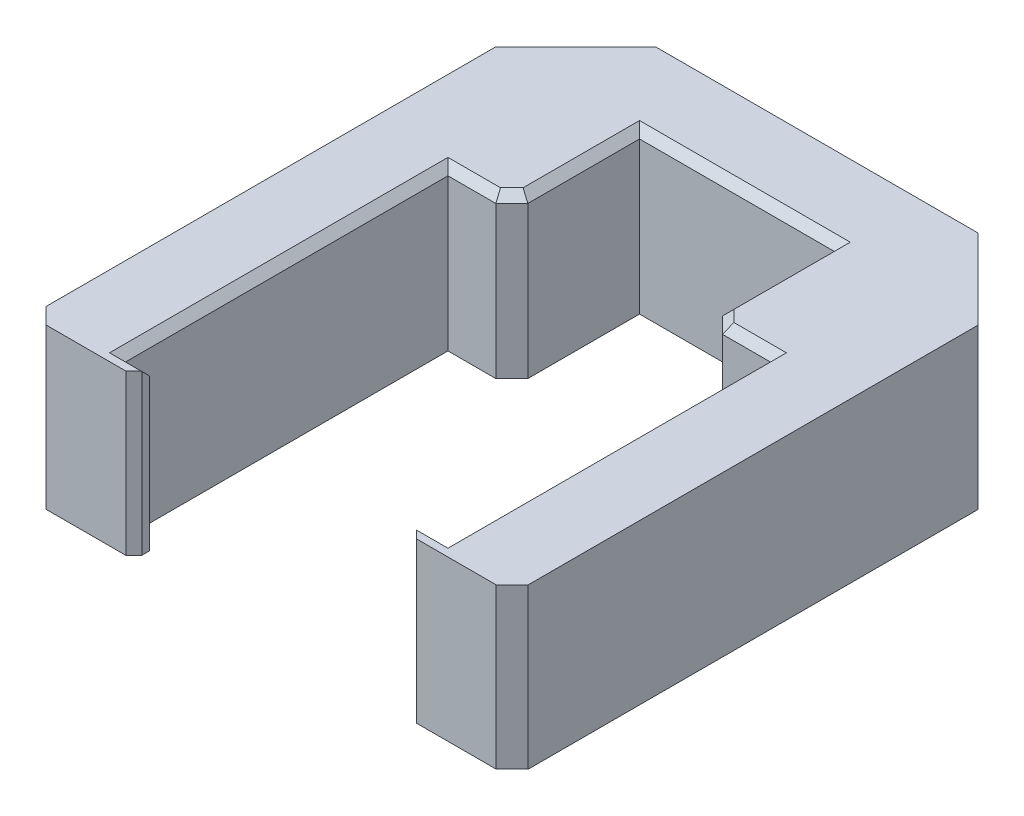
ISO-10303-21;
HEADER;
FILE_DESCRIPTION(('STEP AP214'),'2;1');
FILE_NAME('part.step','',(''),(''),'','','');
FILE_SCHEMA(('AUTOMOTIVE_DESIGN { 1 0 10303 214 1 1 1 1 }'));
ENDSEC;
DATA;
#1=APPLICATION_CONTEXT('core data for automotive mechanical design processes');
#2=APPLICATION_PROTOCOL_DEFINITION('international standard','automotive_design',2000,#1);
#3=PRODUCT_CONTEXT('',#1,'mechanical');
#4=PRODUCT('Part','Part','',(#3));
#5=PRODUCT_RELATED_PRODUCT_CATEGORY('part','',(#4));
#6=PRODUCT_DEFINITION_FORMATION('','',#4);
#7=PRODUCT_DEFINITION_CONTEXT('part definition',#1,'design');
#8=PRODUCT_DEFINITION('design','',#6,#7);
#9=PRODUCT_DEFINITION_SHAPE('','',#8);
#10=(LENGTH_UNIT() NAMED_UNIT(*) SI_UNIT(.MILLI.,.METRE.));
#11=(NAMED_UNIT(*) PLANE_ANGLE_UNIT() SI_UNIT($,.RADIAN.));
#12=(NAMED_UNIT(*) SI_UNIT($,.STERADIAN.) SOLID_ANGLE_UNIT());
#13=UNCERTAINTY_MEASURE_WITH_UNIT(LENGTH_MEASURE(1.E-05),#10,'distance_accuracy_value','');
#14=(GEOMETRIC_REPRESENTATION_CONTEXT(3) GLOBAL_UNCERTAINTY_ASSIGNED_CONTEXT((#13)) GLOBAL_UNIT_ASSIGNED_CONTEXT((#10,
#11,#12)) REPRESENTATION_CONTEXT('',''));
#15=CARTESIAN_POINT('',(0.,0.,0.));
#16=DIRECTION('',(0.,0.,1.));
#17=DIRECTION('',(1.,0.,0.));
#18=AXIS2_PLACEMENT_3D('',#15,#16,#17);
#19=CARTESIAN_POINT('',(18.6,10.,0.));
#20=DIRECTION('',(-1.,0.,0.));
#21=DIRECTION('',(0.,0.,1.));
#22=AXIS2_PLACEMENT_3D('',#19,#20,#21);
#23=PLANE('',#22);
#24=DIRECTION('',(0.,0.,-1.));
#25=VECTOR('',#24,1.);
#26=CARTESIAN_POINT('',(18.6,0.,0.));
#27=LINE('',#26,#25);
#28=CARTESIAN_POINT('',(18.6,0.,0.576654701666499));
#29=VERTEX_POINT('',#28);
#30=CARTESIAN_POINT('',(18.6,0.,0.1));
#31=VERTEX_POINT('',#30);
#32=EDGE_CURVE('E510',#29,#31,#27,.T.);
#33=ORIENTED_EDGE('',*,*,#32,.F.);
#34=DIRECTION('',(0.,1.,0.));
#35=VECTOR('',#34,1.);
#36=CARTESIAN_POINT('',(18.6,10.,0.576654701666499));
#37=LINE('',#36,#35);
#38=CARTESIAN_POINT('',(18.6,9.97665470166651,0.576654701666499));
#39=VERTEX_POINT('',#38);
#40=EDGE_CURVE('E520',#29,#39,#37,.T.);
#41=ORIENTED_EDGE('',*,*,#40,.T.);
#42=DIRECTION('',(0.,0.707106781186552,0.707106781186543));
#43=VECTOR('',#42,1.);
#44=CARTESIAN_POINT('',(18.6,9.7,0.300000000000001));
#45=LINE('',#44,#43);
#46=CARTESIAN_POINT('',(18.6,9.5,0.1));
#47=VERTEX_POINT('',#46);
#48=EDGE_CURVE('E435',#39,#47,#45,.F.);
#49=ORIENTED_EDGE('',*,*,#48,.T.);
#50=DIRECTION('',(0.,-1.,0.));
#51=VECTOR('',#50,1.);
#52=CARTESIAN_POINT('',(18.6,10.,0.1));
#53=LINE('',#52,#51);
#54=EDGE_CURVE('E303',#47,#31,#53,.T.);
#55=ORIENTED_EDGE('',*,*,#54,.T.);
#56=EDGE_LOOP('',(#33,#41,#49,#55));
#57=FACE_BOUND('',#56,.T.);
#58=ADVANCED_FACE('F41',(#57),#23,.T.);
#59=CARTESIAN_POINT('',(0.,10.,1.07665470166651));
#60=DIRECTION('',(0.,0.,1.));
#61=DIRECTION('',(1.,0.,0.));
#62=AXIS2_PLACEMENT_3D('',#59,#60,#61);
#63=PLANE('',#62);
#64=DIRECTION('',(-1.,0.,0.));
#65=VECTOR('',#64,1.);
#66=CARTESIAN_POINT('',(0.,10.,1.07665470166651));
#67=LINE('',#66,#65);
#68=CARTESIAN_POINT('',(24.1000000000001,10.,1.07665470166651));
#69=VERTEX_POINT('',#68);
#70=CARTESIAN_POINT('',(19.1,10.,1.07665470166651));
#71=VERTEX_POINT('',#70);
#72=EDGE_CURVE('E302',#69,#71,#67,.T.);
#73=ORIENTED_EDGE('',*,*,#72,.T.);
#74=DIRECTION('',(0.,-1.,0.));
#75=VECTOR('',#74,1.);
#76=CARTESIAN_POINT('',(19.1,10.,1.07665470166651));
#77=LINE('',#76,#75);
#78=CARTESIAN_POINT('',(19.1,0.,1.07665470166651));
#79=VERTEX_POINT('',#78);
#80=EDGE_CURVE('E470',#71,#79,#77,.T.);
#81=ORIENTED_EDGE('',*,*,#80,.T.);
#82=DIRECTION('',(-1.,0.,0.));
#83=VECTOR('',#82,1.);
#84=CARTESIAN_POINT('',(0.,0.,1.07665470166651));
#85=LINE('',#84,#83);
#86=CARTESIAN_POINT('',(24.1000000000001,0.,1.07665470166651));
#87=VERTEX_POINT('',#86);
#88=EDGE_CURVE('E561',#87,#79,#85,.T.);
#89=ORIENTED_EDGE('',*,*,#88,.F.);
#90=DIRECTION('',(0.,1.,0.));
#91=VECTOR('',#90,1.);
#92=CARTESIAN_POINT('',(24.1000000000001,10.,1.07665470166651));
#93=LINE('',#92,#91);
#94=EDGE_CURVE('E380',#87,#69,#93,.T.);
#95=ORIENTED_EDGE('',*,*,#94,.T.);
#96=EDGE_LOOP('',(#73,#81,#89,#95));
#97=FACE_BOUND('',#96,.T.);
#98=ADVANCED_FACE('F581',(#97),#63,.T.);
#99=CARTESIAN_POINT('',(25.1000000000001,10.,-3.38060018669732E-13));
#100=DIRECTION('',(1.,0.,0.));
#101=DIRECTION('',(0.,0.,-1.));
#102=AXIS2_PLACEMENT_3D('',#99,#100,#101);
#103=PLANE('',#102);
#104=DIRECTION('',(0.,0.,1.));
#105=VECTOR('',#104,1.);
#106=CARTESIAN_POINT('',(25.1000000000001,10.,-3.38060018669732E-13));
#107=LINE('',#106,#105);
#108=CARTESIAN_POINT('',(25.0999999999998,10.,-28.1000000000003));
#109=VERTEX_POINT('',#108);
#110=CARTESIAN_POINT('',(25.1000000000001,10.,0.076654701666525));
#111=VERTEX_POINT('',#110);
#112=EDGE_CURVE('E572',#109,#111,#107,.T.);
#113=ORIENTED_EDGE('',*,*,#112,.T.);
#114=DIRECTION('',(0.,-1.,0.));
#115=VECTOR('',#114,1.);
#116=CARTESIAN_POINT('',(25.1000000000001,10.,0.076654701666525));
#117=LINE('',#116,#115);
#118=CARTESIAN_POINT('',(25.1000000000001,0.,0.076654701666525));
#119=VERTEX_POINT('',#118);
#120=EDGE_CURVE('E376',#111,#119,#117,.T.);
#121=ORIENTED_EDGE('',*,*,#120,.T.);
#122=DIRECTION('',(0.,0.,1.));
#123=VECTOR('',#122,1.);
#124=CARTESIAN_POINT('',(25.1000000000001,0.,-3.38060018669732E-13));
#125=LINE('',#124,#123);
#126=CARTESIAN_POINT('',(25.0999999999998,0.,-28.1000000000003));
#127=VERTEX_POINT('',#126);
#128=EDGE_CURVE('E557',#127,#119,#125,.T.);
#129=ORIENTED_EDGE('',*,*,#128,.F.);
#130=DIRECTION('',(0.,1.,0.));
#131=VECTOR('',#130,1.);
#132=CARTESIAN_POINT('',(25.0999999999998,10.,-28.1000000000003));
#133=LINE('',#132,#131);
#134=EDGE_CURVE('E337',#127,#109,#133,.T.);
#135=ORIENTED_EDGE('',*,*,#134,.T.);
#136=EDGE_LOOP('',(#113,#121,#129,#135));
#137=FACE_BOUND('',#136,.T.);
#138=ADVANCED_FACE('F682',(#137),#103,.T.);
#139=CARTESIAN_POINT('',(0.,10.,-33.1));
#140=DIRECTION('',(0.,0.,-1.));
#141=DIRECTION('',(-1.,0.,0.));
#142=AXIS2_PLACEMENT_3D('',#139,#140,#141);
#143=PLANE('',#142);
#144=DIRECTION('',(1.,0.,0.));
#145=VECTOR('',#144,1.);
#146=CARTESIAN_POINT('',(0.,10.,-33.1));
#147=LINE('',#146,#145);
#148=CARTESIAN_POINT('',(-0.0999999999999896,10.,-33.1));
#149=VERTEX_POINT('',#148);
#150=CARTESIAN_POINT('',(20.0999999999999,10.,-33.1));
#151=VERTEX_POINT('',#150);
#152=EDGE_CURVE('E568',#149,#151,#147,.T.);
#153=ORIENTED_EDGE('',*,*,#152,.T.);
#154=DIRECTION('',(0.,-1.,0.));
#155=VECTOR('',#154,1.);
#156=CARTESIAN_POINT('',(20.0999999999999,10.,-33.1));
#157=LINE('',#156,#155);
#158=CARTESIAN_POINT('',(20.0999999999999,0.,-33.1));
#159=VERTEX_POINT('',#158);
#160=EDGE_CURVE('E327',#151,#159,#157,.T.);
#161=ORIENTED_EDGE('',*,*,#160,.T.);
#162=DIRECTION('',(1.,0.,0.));
#163=VECTOR('',#162,1.);
#164=CARTESIAN_POINT('',(0.,0.,-33.1));
#165=LINE('',#164,#163);
#166=CARTESIAN_POINT('',(-0.0999999999999896,0.,-33.1));
#167=VERTEX_POINT('',#166);
#168=EDGE_CURVE('E551',#167,#159,#165,.T.);
#169=ORIENTED_EDGE('',*,*,#168,.F.);
#170=DIRECTION('',(0.,1.,0.));
#171=VECTOR('',#170,1.);
#172=CARTESIAN_POINT('',(-0.0999999999999896,10.,-33.1));
#173=LINE('',#172,#171);
#174=EDGE_CURVE('E259',#167,#149,#173,.T.);
#175=ORIENTED_EDGE('',*,*,#174,.T.);
#176=EDGE_LOOP('',(#153,#161,#169,#175));
#177=FACE_BOUND('',#176,.T.);
#178=ADVANCED_FACE('F949',(#177),#143,.T.);
#179=CARTESIAN_POINT('',(-5.1,10.,0.));
#180=DIRECTION('',(-1.,0.,0.));
#181=DIRECTION('',(0.,0.,1.));
#182=AXIS2_PLACEMENT_3D('',#179,#180,#181);
#183=PLANE('',#182);
#184=DIRECTION('',(0.,0.,-1.));
#185=VECTOR('',#184,1.);
#186=CARTESIAN_POINT('',(-5.1,0.,0.));
#187=LINE('',#186,#185);
#188=CARTESIAN_POINT('',(-5.1,0.,0.0766547016664981));
#189=VERTEX_POINT('',#188);
#190=CARTESIAN_POINT('',(-5.1,0.,-28.1));
#191=VERTEX_POINT('',#190);
#192=EDGE_CURVE('E549',#189,#191,#187,.T.);
#193=ORIENTED_EDGE('',*,*,#192,.F.);
#194=DIRECTION('',(0.,1.,0.));
#195=VECTOR('',#194,1.);
#196=CARTESIAN_POINT('',(-5.1,10.,0.0766547016664981));
#197=LINE('',#196,#195);
#198=CARTESIAN_POINT('',(-5.1,10.,0.0766547016664981));
#199=VERTEX_POINT('',#198);
#200=EDGE_CURVE('E367',#189,#199,#197,.T.);
#201=ORIENTED_EDGE('',*,*,#200,.T.);
#202=DIRECTION('',(0.,0.,-1.));
#203=VECTOR('',#202,1.);
#204=CARTESIAN_POINT('',(-5.1,10.,0.));
#205=LINE('',#204,#203);
#206=CARTESIAN_POINT('',(-5.1,10.,-28.1));
#207=VERTEX_POINT('',#206);
#208=EDGE_CURVE('E545',#199,#207,#205,.T.);
#209=ORIENTED_EDGE('',*,*,#208,.T.);
#210=DIRECTION('',(0.,-1.,0.));
#211=VECTOR('',#210,1.);
#212=CARTESIAN_POINT('',(-5.1,10.,-28.1));
#213=LINE('',#212,#211);
#214=EDGE_CURVE('E347',#207,#191,#213,.T.);
#215=ORIENTED_EDGE('',*,*,#214,.T.);
#216=EDGE_LOOP('',(#193,#201,#209,#215));
#217=FACE_BOUND('',#216,.T.);
#218=ADVANCED_FACE('F942',(#217),#183,.T.);
#219=CARTESIAN_POINT('',(0.,10.,1.07665470166651));
#220=DIRECTION('',(0.,0.,-1.));
#221=DIRECTION('',(-1.,0.,0.));
#222=AXIS2_PLACEMENT_3D('',#219,#220,#221);
#223=PLANE('',#222);
#224=DIRECTION('',(1.,0.,0.));
#225=VECTOR('',#224,1.);
#226=CARTESIAN_POINT('',(0.,0.,1.07665470166651));
#227=LINE('',#226,#225);
#228=CARTESIAN_POINT('',(-4.09999999999999,0.,1.07665470166651));
#229=VERTEX_POINT('',#228);
#230=CARTESIAN_POINT('',(0.900000000000001,0.,1.07665470166651));
#231=VERTEX_POINT('',#230);
#232=EDGE_CURVE('E250',#229,#231,#227,.T.);
#233=ORIENTED_EDGE('',*,*,#232,.T.);
#234=DIRECTION('',(0.,1.,0.));
#235=VECTOR('',#234,1.);
#236=CARTESIAN_POINT('',(0.900000000000001,10.,1.07665470166651));
#237=LINE('',#236,#235);
#238=CARTESIAN_POINT('',(0.900000000000001,10.,1.07665470166651));
#239=VERTEX_POINT('',#238);
#240=EDGE_CURVE('E50',#231,#239,#237,.T.);
#241=ORIENTED_EDGE('',*,*,#240,.T.);
#242=DIRECTION('',(1.,0.,0.));
#243=VECTOR('',#242,1.);
#244=CARTESIAN_POINT('',(0.,10.,1.07665470166651));
#245=LINE('',#244,#243);
#246=CARTESIAN_POINT('',(-4.09999999999999,10.,1.07665470166651));
#247=VERTEX_POINT('',#246);
#248=EDGE_CURVE('E308',#247,#239,#245,.T.);
#249=ORIENTED_EDGE('',*,*,#248,.F.);
#250=DIRECTION('',(0.,-1.,0.));
#251=VECTOR('',#250,1.);
#252=CARTESIAN_POINT('',(-4.09999999999999,0.,1.07665470166651));
#253=LINE('',#252,#251);
#254=EDGE_CURVE('E351',#247,#229,#253,.T.);
#255=ORIENTED_EDGE('',*,*,#254,.T.);
#256=EDGE_LOOP('',(#233,#241,#249,#255));
#257=FACE_BOUND('',#256,.T.);
#258=ADVANCED_FACE('F537',(#257),#223,.F.);
#259=CARTESIAN_POINT('',(1.4,10.,0.));
#260=DIRECTION('',(-1.,0.,0.));
#261=DIRECTION('',(0.,0.,1.));
#262=AXIS2_PLACEMENT_3D('',#259,#260,#261);
#263=PLANE('',#262);
#264=DIRECTION('',(0.,-0.707106781186552,-0.707106781186543));
#265=VECTOR('',#264,1.);
#266=CARTESIAN_POINT('',(1.4,9.5,0.1));
#267=LINE('',#266,#265);
#268=CARTESIAN_POINT('',(1.4,9.5,0.1));
#269=VERTEX_POINT('',#268);
#270=CARTESIAN_POINT('',(1.4,9.97665470166653,0.576654701666519));
#271=VERTEX_POINT('',#270);
#272=EDGE_CURVE('E461',#269,#271,#267,.F.);
#273=ORIENTED_EDGE('',*,*,#272,.T.);
#274=DIRECTION('',(0.,-1.,0.));
#275=VECTOR('',#274,1.);
#276=CARTESIAN_POINT('',(1.4,10.,0.576654701666519));
#277=LINE('',#276,#275);
#278=CARTESIAN_POINT('',(1.4,0.,0.576654701666519));
#279=VERTEX_POINT('',#278);
#280=EDGE_CURVE('E245',#271,#279,#277,.T.);
#281=ORIENTED_EDGE('',*,*,#280,.T.);
#282=DIRECTION('',(0.,0.,-1.));
#283=VECTOR('',#282,1.);
#284=CARTESIAN_POINT('',(1.4,0.,0.));
#285=LINE('',#284,#283);
#286=CARTESIAN_POINT('',(1.4,0.,0.1));
#287=VERTEX_POINT('',#286);
#288=EDGE_CURVE('E240',#279,#287,#285,.T.);
#289=ORIENTED_EDGE('',*,*,#288,.T.);
#290=DIRECTION('',(0.,-1.,0.));
#291=VECTOR('',#290,1.);
#292=CARTESIAN_POINT('',(1.4,10.,0.1));
#293=LINE('',#292,#291);
#294=EDGE_CURVE('E243',#269,#287,#293,.T.);
#295=ORIENTED_EDGE('',*,*,#294,.F.);
#296=EDGE_LOOP('',(#273,#281,#289,#295));
#297=FACE_BOUND('',#296,.T.);
#298=ADVANCED_FACE('F242',(#297),#263,.F.);
#299=CARTESIAN_POINT('',(0.,10.,0.1));
#300=DIRECTION('',(0.,0.,-1.));
#301=DIRECTION('',(-1.,0.,0.));
#302=AXIS2_PLACEMENT_3D('',#299,#300,#301);
#303=PLANE('',#302);
#304=DIRECTION('',(0.,-1.,0.));
#305=VECTOR('',#304,1.);
#306=CARTESIAN_POINT('',(-0.1,10.,0.1));
#307=LINE('',#306,#305);
#308=CARTESIAN_POINT('',(-0.1,9.5,0.1));
#309=VERTEX_POINT('',#308);
#310=CARTESIAN_POINT('',(-0.1,0.,0.1));
#311=VERTEX_POINT('',#310);
#312=EDGE_CURVE('E260',#309,#311,#307,.T.);
#313=ORIENTED_EDGE('',*,*,#312,.F.);
#314=DIRECTION('',(1.,0.,0.));
#315=VECTOR('',#314,1.);
#316=CARTESIAN_POINT('',(0.,9.5,0.1));
#317=LINE('',#316,#315);
#318=EDGE_CURVE('E257',#309,#269,#317,.T.);
#319=ORIENTED_EDGE('',*,*,#318,.T.);
#320=ORIENTED_EDGE('',*,*,#294,.T.);
#321=DIRECTION('',(1.,0.,0.));
#322=VECTOR('',#321,1.);
#323=CARTESIAN_POINT('',(0.,0.,0.1));
#324=LINE('',#323,#322);
#325=EDGE_CURVE('E249',#311,#287,#324,.T.);
#326=ORIENTED_EDGE('',*,*,#325,.F.);
#327=EDGE_LOOP('',(#313,#319,#320,#326));
#328=FACE_BOUND('',#327,.T.);
#329=ADVANCED_FACE('F255',(#328),#303,.T.);
#330=CARTESIAN_POINT('',(-0.1,10.,0.));
#331=DIRECTION('',(-1.,0.,0.));
#332=DIRECTION('',(0.,0.,1.));
#333=AXIS2_PLACEMENT_3D('',#330,#331,#332);
#334=PLANE('',#333);
#335=DIRECTION('',(0.,-1.,0.));
#336=VECTOR('',#335,1.);
#337=CARTESIAN_POINT('',(-0.1,10.,-20.1));
#338=LINE('',#337,#336);
#339=CARTESIAN_POINT('',(-0.1,9.5,-20.1));
#340=VERTEX_POINT('',#339);
#341=CARTESIAN_POINT('',(-0.1,0.,-20.1));
#342=VERTEX_POINT('',#341);
#343=EDGE_CURVE('E320',#340,#342,#338,.T.);
#344=ORIENTED_EDGE('',*,*,#343,.F.);
#345=DIRECTION('',(0.,0.,1.));
#346=VECTOR('',#345,1.);
#347=CARTESIAN_POINT('',(-0.1,9.5,0.1));
#348=LINE('',#347,#346);
#349=EDGE_CURVE('E467',#340,#309,#348,.T.);
#350=ORIENTED_EDGE('',*,*,#349,.T.);
#351=ORIENTED_EDGE('',*,*,#312,.T.);
#352=DIRECTION('',(0.,0.,-1.));
#353=VECTOR('',#352,1.);
#354=CARTESIAN_POINT('',(-0.1,0.,0.));
#355=LINE('',#354,#353);
#356=EDGE_CURVE('E267',#311,#342,#355,.T.);
#357=ORIENTED_EDGE('',*,*,#356,.T.);
#358=EDGE_LOOP('',(#344,#350,#351,#357));
#359=FACE_BOUND('',#358,.T.);
#360=ADVANCED_FACE('F663',(#359),#334,.F.);
#361=CARTESIAN_POINT('',(0.,10.,-20.1));
#362=DIRECTION('',(0.,0.,-1.));
#363=DIRECTION('',(-1.,0.,0.));
#364=AXIS2_PLACEMENT_3D('',#361,#362,#363);
#365=PLANE('',#364);
#366=DIRECTION('',(0.,1.,0.));
#367=VECTOR('',#366,1.);
#368=CARTESIAN_POINT('',(2.89999999999999,10.,-20.1));
#369=LINE('',#368,#367);
#370=CARTESIAN_POINT('',(2.89999999999999,0.,-20.1));
#371=VERTEX_POINT('',#370);
#372=CARTESIAN_POINT('',(2.89999999999999,9.5,-20.1));
#373=VERTEX_POINT('',#372);
#374=EDGE_CURVE('E393',#371,#373,#369,.T.);
#375=ORIENTED_EDGE('',*,*,#374,.T.);
#376=DIRECTION('',(-1.,0.,0.));
#377=VECTOR('',#376,1.);
#378=CARTESIAN_POINT('',(-0.1,9.5,-20.1));
#379=LINE('',#378,#377);
#380=EDGE_CURVE('E464',#373,#340,#379,.T.);
#381=ORIENTED_EDGE('',*,*,#380,.T.);
#382=ORIENTED_EDGE('',*,*,#343,.T.);
#383=DIRECTION('',(1.,0.,0.));
#384=VECTOR('',#383,1.);
#385=CARTESIAN_POINT('',(0.,0.,-20.1));
#386=LINE('',#385,#384);
#387=EDGE_CURVE('E271',#342,#371,#386,.T.);
#388=ORIENTED_EDGE('',*,*,#387,.T.);
#389=EDGE_LOOP('',(#375,#381,#382,#388));
#390=FACE_BOUND('',#389,.T.);
#391=ADVANCED_FACE('F660',(#390),#365,.F.);
#392=CARTESIAN_POINT('',(3.9,10.,0.));
#393=DIRECTION('',(-1.,0.,0.));
#394=DIRECTION('',(0.,0.,1.));
#395=AXIS2_PLACEMENT_3D('',#392,#393,#394);
#396=PLANE('',#395);
#397=DIRECTION('',(0.,-1.,0.));
#398=VECTOR('',#397,1.);
#399=CARTESIAN_POINT('',(3.9,10.,-28.1));
#400=LINE('',#399,#398);
#401=CARTESIAN_POINT('',(3.9,9.5,-28.1));
#402=VERTEX_POINT('',#401);
#403=CARTESIAN_POINT('',(3.9,0.,-28.1));
#404=VERTEX_POINT('',#403);
#405=EDGE_CURVE('E317',#402,#404,#400,.T.);
#406=ORIENTED_EDGE('',*,*,#405,.F.);
#407=DIRECTION('',(0.,0.,1.));
#408=VECTOR('',#407,1.);
#409=CARTESIAN_POINT('',(3.9,9.5,-21.1));
#410=LINE('',#409,#408);
#411=CARTESIAN_POINT('',(3.9,9.5,-21.1));
#412=VERTEX_POINT('',#411);
#413=EDGE_CURVE('E453',#402,#412,#410,.T.);
#414=ORIENTED_EDGE('',*,*,#413,.T.);
#415=DIRECTION('',(0.,-1.,0.));
#416=VECTOR('',#415,1.);
#417=CARTESIAN_POINT('',(3.9,10.,-21.1));
#418=LINE('',#417,#416);
#419=CARTESIAN_POINT('',(3.9,0.,-21.1));
#420=VERTEX_POINT('',#419);
#421=EDGE_CURVE('E390',#412,#420,#418,.T.);
#422=ORIENTED_EDGE('',*,*,#421,.T.);
#423=DIRECTION('',(0.,0.,-1.));
#424=VECTOR('',#423,1.);
#425=CARTESIAN_POINT('',(3.9,0.,0.));
#426=LINE('',#425,#424);
#427=EDGE_CURVE('E278',#420,#404,#426,.T.);
#428=ORIENTED_EDGE('',*,*,#427,.T.);
#429=EDGE_LOOP('',(#406,#414,#422,#428));
#430=FACE_BOUND('',#429,.T.);
#431=ADVANCED_FACE('F643',(#430),#396,.F.);
#432=CARTESIAN_POINT('',(0.,10.,-28.1));
#433=DIRECTION('',(0.,0.,-1.));
#434=DIRECTION('',(-1.,0.,0.));
#435=AXIS2_PLACEMENT_3D('',#432,#433,#434);
#436=PLANE('',#435);
#437=DIRECTION('',(0.,-1.,0.));
#438=VECTOR('',#437,1.);
#439=CARTESIAN_POINT('',(16.1,10.,-28.1));
#440=LINE('',#439,#438);
#441=CARTESIAN_POINT('',(16.1,9.5,-28.1));
#442=VERTEX_POINT('',#441);
#443=CARTESIAN_POINT('',(16.1,0.,-28.1));
#444=VERTEX_POINT('',#443);
#445=EDGE_CURVE('E314',#442,#444,#440,.T.);
#446=ORIENTED_EDGE('',*,*,#445,.F.);
#447=DIRECTION('',(-1.,0.,0.));
#448=VECTOR('',#447,1.);
#449=CARTESIAN_POINT('',(3.9,9.5,-28.1));
#450=LINE('',#449,#448);
#451=EDGE_CURVE('E450',#442,#402,#450,.T.);
#452=ORIENTED_EDGE('',*,*,#451,.T.);
#453=ORIENTED_EDGE('',*,*,#405,.T.);
#454=DIRECTION('',(1.,0.,0.));
#455=VECTOR('',#454,1.);
#456=CARTESIAN_POINT('',(0.,0.,-28.1));
#457=LINE('',#456,#455);
#458=EDGE_CURVE('E282',#404,#444,#457,.T.);
#459=ORIENTED_EDGE('',*,*,#458,.T.);
#460=EDGE_LOOP('',(#446,#452,#453,#459));
#461=FACE_BOUND('',#460,.T.);
#462=ADVANCED_FACE('F622',(#461),#436,.F.);
#463=CARTESIAN_POINT('',(16.1,10.,0.));
#464=DIRECTION('',(-1.,0.,0.));
#465=DIRECTION('',(0.,0.,1.));
#466=AXIS2_PLACEMENT_3D('',#463,#464,#465);
#467=PLANE('',#466);
#468=DIRECTION('',(0.,1.,0.));
#469=VECTOR('',#468,1.);
#470=CARTESIAN_POINT('',(16.1,10.,-21.1));
#471=LINE('',#470,#469);
#472=CARTESIAN_POINT('',(16.1,0.,-21.1));
#473=VERTEX_POINT('',#472);
#474=CARTESIAN_POINT('',(16.1,9.5,-21.1));
#475=VERTEX_POINT('',#474);
#476=EDGE_CURVE('E386',#473,#475,#471,.T.);
#477=ORIENTED_EDGE('',*,*,#476,.T.);
#478=DIRECTION('',(0.,0.,-1.));
#479=VECTOR('',#478,1.);
#480=CARTESIAN_POINT('',(16.1,9.5,0.));
#481=LINE('',#480,#479);
#482=EDGE_CURVE('E447',#475,#442,#481,.T.);
#483=ORIENTED_EDGE('',*,*,#482,.T.);
#484=ORIENTED_EDGE('',*,*,#445,.T.);
#485=DIRECTION('',(0.,0.,-1.));
#486=VECTOR('',#485,1.);
#487=CARTESIAN_POINT('',(16.1,0.,0.));
#488=LINE('',#487,#486);
#489=EDGE_CURVE('E286',#473,#444,#488,.T.);
#490=ORIENTED_EDGE('',*,*,#489,.F.);
#491=EDGE_LOOP('',(#477,#483,#484,#490));
#492=FACE_BOUND('',#491,.T.);
#493=ADVANCED_FACE('F617',(#492),#467,.T.);
#494=CARTESIAN_POINT('',(0.,10.,-20.1));
#495=DIRECTION('',(0.,0.,-1.));
#496=DIRECTION('',(-1.,0.,0.));
#497=AXIS2_PLACEMENT_3D('',#494,#495,#496);
#498=PLANE('',#497);
#499=DIRECTION('',(0.,-1.,0.));
#500=VECTOR('',#499,1.);
#501=CARTESIAN_POINT('',(20.1,10.,-20.1));
#502=LINE('',#501,#500);
#503=CARTESIAN_POINT('',(20.1,9.5,-20.1));
#504=VERTEX_POINT('',#503);
#505=CARTESIAN_POINT('',(20.1,0.,-20.1));
#506=VERTEX_POINT('',#505);
#507=EDGE_CURVE('E311',#504,#506,#502,.T.);
#508=ORIENTED_EDGE('',*,*,#507,.F.);
#509=DIRECTION('',(-1.,0.,0.));
#510=VECTOR('',#509,1.);
#511=CARTESIAN_POINT('',(17.1,9.5,-20.1));
#512=LINE('',#511,#510);
#513=CARTESIAN_POINT('',(17.1,9.5,-20.1));
#514=VERTEX_POINT('',#513);
#515=EDGE_CURVE('E441',#504,#514,#512,.T.);
#516=ORIENTED_EDGE('',*,*,#515,.T.);
#517=DIRECTION('',(0.,-1.,0.));
#518=VECTOR('',#517,1.);
#519=CARTESIAN_POINT('',(17.1,0.,-20.1));
#520=LINE('',#519,#518);
#521=CARTESIAN_POINT('',(17.1,0.,-20.1));
#522=VERTEX_POINT('',#521);
#523=EDGE_CURVE('E383',#514,#522,#520,.T.);
#524=ORIENTED_EDGE('',*,*,#523,.T.);
#525=DIRECTION('',(1.,0.,0.));
#526=VECTOR('',#525,1.);
#527=CARTESIAN_POINT('',(0.,0.,-20.1));
#528=LINE('',#527,#526);
#529=EDGE_CURVE('E290',#522,#506,#528,.T.);
#530=ORIENTED_EDGE('',*,*,#529,.T.);
#531=EDGE_LOOP('',(#508,#516,#524,#530));
#532=FACE_BOUND('',#531,.T.);
#533=ADVANCED_FACE('F607',(#532),#498,.F.);
#534=CARTESIAN_POINT('',(20.1,10.,0.));
#535=DIRECTION('',(-1.,0.,0.));
#536=DIRECTION('',(0.,0.,1.));
#537=AXIS2_PLACEMENT_3D('',#534,#535,#536);
#538=PLANE('',#537);
#539=DIRECTION('',(0.,-1.,0.));
#540=VECTOR('',#539,1.);
#541=CARTESIAN_POINT('',(20.1000000000001,10.,0.1));
#542=LINE('',#541,#540);
#543=CARTESIAN_POINT('',(20.1000000000001,9.5,0.1));
#544=VERTEX_POINT('',#543);
#545=CARTESIAN_POINT('',(20.1000000000001,0.,0.1));
#546=VERTEX_POINT('',#545);
#547=EDGE_CURVE('E307',#544,#546,#542,.T.);
#548=ORIENTED_EDGE('',*,*,#547,.F.);
#549=DIRECTION('',(0.,0.,-1.));
#550=VECTOR('',#549,1.);
#551=CARTESIAN_POINT('',(20.1,9.5,0.));
#552=LINE('',#551,#550);
#553=EDGE_CURVE('E438',#544,#504,#552,.T.);
#554=ORIENTED_EDGE('',*,*,#553,.T.);
#555=ORIENTED_EDGE('',*,*,#507,.T.);
#556=DIRECTION('',(0.,0.,-1.));
#557=VECTOR('',#556,1.);
#558=CARTESIAN_POINT('',(20.1,0.,0.));
#559=LINE('',#558,#557);
#560=EDGE_CURVE('E294',#546,#506,#559,.T.);
#561=ORIENTED_EDGE('',*,*,#560,.F.);
#562=EDGE_LOOP('',(#548,#554,#555,#561));
#563=FACE_BOUND('',#562,.T.);
#564=ADVANCED_FACE('F602',(#563),#538,.T.);
#565=CARTESIAN_POINT('',(0.,10.,0.100000000000001));
#566=DIRECTION('',(0.,0.,-1.));
#567=DIRECTION('',(-1.,0.,0.));
#568=AXIS2_PLACEMENT_3D('',#565,#566,#567);
#569=PLANE('',#568);
#570=ORIENTED_EDGE('',*,*,#54,.F.);
#571=DIRECTION('',(1.,0.,0.));
#572=VECTOR('',#571,1.);
#573=CARTESIAN_POINT('',(0.,9.5,0.100000000000001));
#574=LINE('',#573,#572);
#575=EDGE_CURVE('E397',#47,#544,#574,.T.);
#576=ORIENTED_EDGE('',*,*,#575,.T.);
#577=ORIENTED_EDGE('',*,*,#547,.T.);
#578=DIRECTION('',(1.,0.,0.));
#579=VECTOR('',#578,1.);
#580=CARTESIAN_POINT('',(0.,0.,0.100000000000001));
#581=LINE('',#580,#579);
#582=EDGE_CURVE('E298',#31,#546,#581,.T.);
#583=ORIENTED_EDGE('',*,*,#582,.F.);
#584=EDGE_LOOP('',(#570,#576,#577,#583));
#585=FACE_BOUND('',#584,.T.);
#586=ADVANCED_FACE('F597',(#585),#569,.T.);
#587=CARTESIAN_POINT('',(0.,10.,0.));
#588=DIRECTION('',(0.,1.,0.));
#589=DIRECTION('',(0.,0.,1.));
#590=AXIS2_PLACEMENT_3D('',#587,#588,#589);
#591=PLANE('',#590);
#592=DIRECTION('',(-1.,0.,0.));
#593=VECTOR('',#592,1.);
#594=CARTESIAN_POINT('',(0.,10.,0.599999999999994));
#595=LINE('',#594,#593);
#596=CARTESIAN_POINT('',(20.6,10.,0.599999999999994));
#597=VERTEX_POINT('',#596);
#598=CARTESIAN_POINT('',(18.6233452983335,10.,0.599999999999994));
#599=VERTEX_POINT('',#598);
#600=EDGE_CURVE('E431',#597,#599,#595,.T.);
#601=ORIENTED_EDGE('',*,*,#600,.T.);
#602=DIRECTION('',(-0.707106781186543,0.,-0.707106781186552));
#603=VECTOR('',#602,1.);
#604=CARTESIAN_POINT('',(9.01167264916688,10.,-9.01167264916675));
#605=LINE('',#604,#603);
#606=EDGE_CURVE('E528',#599,#71,#605,.F.);
#607=ORIENTED_EDGE('',*,*,#606,.T.);
#608=ORIENTED_EDGE('',*,*,#72,.F.);
#609=DIRECTION('',(-0.70710678118655,0.,0.707106781186545));
#610=VECTOR('',#609,1.);
#611=CARTESIAN_POINT('',(12.5883273508332,10.,12.5883273508333));
#612=LINE('',#611,#610);
#613=EDGE_CURVE('E370',#69,#111,#612,.F.);
#614=ORIENTED_EDGE('',*,*,#613,.T.);
#615=ORIENTED_EDGE('',*,*,#112,.F.);
#616=DIRECTION('',(0.707106781186555,0.,0.70710678118654));
#617=VECTOR('',#616,1.);
#618=CARTESIAN_POINT('',(26.5999999999997,10.,-26.6000000000003));
#619=LINE('',#618,#617);
#620=EDGE_CURVE('E344',#109,#151,#619,.F.);
#621=ORIENTED_EDGE('',*,*,#620,.T.);
#622=ORIENTED_EDGE('',*,*,#152,.F.);
#623=DIRECTION('',(0.707106781186549,0.,-0.707106781186546));
#624=VECTOR('',#623,1.);
#625=CARTESIAN_POINT('',(-16.6,10.,-16.6000000000001));
#626=LINE('',#625,#624);
#627=EDGE_CURVE('E340',#149,#207,#626,.F.);
#628=ORIENTED_EDGE('',*,*,#627,.T.);
#629=ORIENTED_EDGE('',*,*,#208,.F.);
#630=DIRECTION('',(0.707106781186545,0.,0.70710678118655));
#631=VECTOR('',#630,1.);
#632=CARTESIAN_POINT('',(-2.58832735083327,10.,2.58832735083325));
#633=LINE('',#632,#631);
#634=EDGE_CURVE('E373',#199,#247,#633,.T.);
#635=ORIENTED_EDGE('',*,*,#634,.T.);
#636=ORIENTED_EDGE('',*,*,#248,.T.);
#637=DIRECTION('',(-0.707106781186552,0.,0.707106781186543));
#638=VECTOR('',#637,1.);
#639=CARTESIAN_POINT('',(0.988327350833251,10.,0.988327350833264));
#640=LINE('',#639,#638);
#641=CARTESIAN_POINT('',(1.37665470166653,10.,0.599999999999994));
#642=VERTEX_POINT('',#641);
#643=EDGE_CURVE('E63',#239,#642,#640,.F.);
#644=ORIENTED_EDGE('',*,*,#643,.T.);
#645=DIRECTION('',(-1.,0.,0.));
#646=VECTOR('',#645,1.);
#647=CARTESIAN_POINT('',(0.,10.,0.599999999999994));
#648=LINE('',#647,#646);
#649=CARTESIAN_POINT('',(-0.599999999999994,10.,0.599999999999994));
#650=VERTEX_POINT('',#649);
#651=EDGE_CURVE('E407',#642,#650,#648,.T.);
#652=ORIENTED_EDGE('',*,*,#651,.T.);
#653=DIRECTION('',(0.,0.,-1.));
#654=VECTOR('',#653,1.);
#655=CARTESIAN_POINT('',(-0.599999999999994,10.,-20.1));
#656=LINE('',#655,#654);
#657=CARTESIAN_POINT('',(-0.599999999999994,10.,-20.6));
#658=VERTEX_POINT('',#657);
#659=EDGE_CURVE('E401',#650,#658,#656,.T.);
#660=ORIENTED_EDGE('',*,*,#659,.T.);
#661=DIRECTION('',(1.,0.,0.));
#662=VECTOR('',#661,1.);
#663=CARTESIAN_POINT('',(2.89999999999999,10.,-20.6));
#664=LINE('',#663,#662);
#665=CARTESIAN_POINT('',(2.69289321881345,10.,-20.6));
#666=VERTEX_POINT('',#665);
#667=EDGE_CURVE('E404',#658,#666,#664,.T.);
#668=ORIENTED_EDGE('',*,*,#667,.T.);
#669=DIRECTION('',(0.70710678118655,0.,-0.707106781186545));
#670=VECTOR('',#669,1.);
#671=CARTESIAN_POINT('',(-8.95355339059328,10.,-8.95355339059334));
#672=LINE('',#671,#670);
#673=CARTESIAN_POINT('',(3.40000000000001,10.,-21.3071067811865));
#674=VERTEX_POINT('',#673);
#675=EDGE_CURVE('E410',#666,#674,#672,.T.);
#676=ORIENTED_EDGE('',*,*,#675,.T.);
#677=DIRECTION('',(0.,0.,-1.));
#678=VECTOR('',#677,1.);
#679=CARTESIAN_POINT('',(3.40000000000001,10.,-28.1));
#680=LINE('',#679,#678);
#681=CARTESIAN_POINT('',(3.40000000000001,10.,-28.6));
#682=VERTEX_POINT('',#681);
#683=EDGE_CURVE('E413',#674,#682,#680,.T.);
#684=ORIENTED_EDGE('',*,*,#683,.T.);
#685=DIRECTION('',(1.,0.,0.));
#686=VECTOR('',#685,1.);
#687=CARTESIAN_POINT('',(16.1,10.,-28.6));
#688=LINE('',#687,#686);
#689=CARTESIAN_POINT('',(16.6,10.,-28.6));
#690=VERTEX_POINT('',#689);
#691=EDGE_CURVE('E416',#682,#690,#688,.T.);
#692=ORIENTED_EDGE('',*,*,#691,.T.);
#693=DIRECTION('',(0.,0.,1.));
#694=VECTOR('',#693,1.);
#695=CARTESIAN_POINT('',(16.6,10.,0.));
#696=LINE('',#695,#694);
#697=CARTESIAN_POINT('',(16.6,10.,-21.3071067811865));
#698=VERTEX_POINT('',#697);
#699=EDGE_CURVE('E419',#690,#698,#696,.T.);
#700=ORIENTED_EDGE('',*,*,#699,.T.);
#701=DIRECTION('',(0.707106781186545,0.,0.70710678118655));
#702=VECTOR('',#701,1.);
#703=CARTESIAN_POINT('',(18.9535533905933,10.,-18.9535533905932));
#704=LINE('',#703,#702);
#705=CARTESIAN_POINT('',(17.3071067811865,10.,-20.6));
#706=VERTEX_POINT('',#705);
#707=EDGE_CURVE('E422',#698,#706,#704,.T.);
#708=ORIENTED_EDGE('',*,*,#707,.T.);
#709=DIRECTION('',(1.,0.,0.));
#710=VECTOR('',#709,1.);
#711=CARTESIAN_POINT('',(20.1,10.,-20.6));
#712=LINE('',#711,#710);
#713=CARTESIAN_POINT('',(20.6,10.,-20.6));
#714=VERTEX_POINT('',#713);
#715=EDGE_CURVE('E425',#706,#714,#712,.T.);
#716=ORIENTED_EDGE('',*,*,#715,.T.);
#717=DIRECTION('',(0.,0.,1.));
#718=VECTOR('',#717,1.);
#719=CARTESIAN_POINT('',(20.6,10.,0.));
#720=LINE('',#719,#718);
#721=EDGE_CURVE('E428',#714,#597,#720,.T.);
#722=ORIENTED_EDGE('',*,*,#721,.T.);
#723=EDGE_LOOP('',(#601,#607,#608,#614,#615,#621,#622,#628,#629,#635,#636,#644,#652,#660,#668,
#676,#684,#692,#700,#708,#716,#722));
#724=FACE_BOUND('',#723,.T.);
#725=ADVANCED_FACE('F541',(#724),#591,.T.);
#726=CARTESIAN_POINT('',(0.,0.,0.));
#727=DIRECTION('',(0.,1.,0.));
#728=DIRECTION('',(0.,0.,1.));
#729=AXIS2_PLACEMENT_3D('',#726,#727,#728);
#730=PLANE('',#729);
#731=ORIENTED_EDGE('',*,*,#88,.T.);
#732=DIRECTION('',(0.707106781186543,0.,0.707106781186552));
#733=VECTOR('',#732,1.);
#734=CARTESIAN_POINT('',(19.1,0.,1.07665470166651));
#735=LINE('',#734,#733);
#736=EDGE_CURVE('E517',#79,#29,#735,.F.);
#737=ORIENTED_EDGE('',*,*,#736,.T.);
#738=ORIENTED_EDGE('',*,*,#32,.T.);
#739=ORIENTED_EDGE('',*,*,#582,.T.);
#740=ORIENTED_EDGE('',*,*,#560,.T.);
#741=ORIENTED_EDGE('',*,*,#529,.F.);
#742=DIRECTION('',(-0.707106781186545,0.,-0.70710678118655));
#743=VECTOR('',#742,1.);
#744=CARTESIAN_POINT('',(17.1,0.,-20.1));
#745=LINE('',#744,#743);
#746=EDGE_CURVE('E358',#522,#473,#745,.T.);
#747=ORIENTED_EDGE('',*,*,#746,.T.);
#748=ORIENTED_EDGE('',*,*,#489,.T.);
#749=ORIENTED_EDGE('',*,*,#458,.F.);
#750=ORIENTED_EDGE('',*,*,#427,.F.);
#751=DIRECTION('',(0.70710678118655,0.,-0.707106781186545));
#752=VECTOR('',#751,1.);
#753=CARTESIAN_POINT('',(3.9,0.,-21.1));
#754=LINE('',#753,#752);
#755=EDGE_CURVE('E355',#420,#371,#754,.F.);
#756=ORIENTED_EDGE('',*,*,#755,.T.);
#757=ORIENTED_EDGE('',*,*,#387,.F.);
#758=ORIENTED_EDGE('',*,*,#356,.F.);
#759=ORIENTED_EDGE('',*,*,#325,.T.);
#760=ORIENTED_EDGE('',*,*,#288,.F.);
#761=DIRECTION('',(0.707106781186552,0.,-0.707106781186543));
#762=VECTOR('',#761,1.);
#763=CARTESIAN_POINT('',(1.4,0.,0.576654701666519));
#764=LINE('',#763,#762);
#765=EDGE_CURVE('E514',#279,#231,#764,.F.);
#766=ORIENTED_EDGE('',*,*,#765,.T.);
#767=ORIENTED_EDGE('',*,*,#232,.F.);
#768=DIRECTION('',(-0.707106781186545,0.,-0.70710678118655));
#769=VECTOR('',#768,1.);
#770=CARTESIAN_POINT('',(-4.09999999999999,0.,1.07665470166651));
#771=LINE('',#770,#769);
#772=EDGE_CURVE('E364',#229,#189,#771,.T.);
#773=ORIENTED_EDGE('',*,*,#772,.T.);
#774=ORIENTED_EDGE('',*,*,#192,.T.);
#775=DIRECTION('',(-0.707106781186549,0.,0.707106781186546));
#776=VECTOR('',#775,1.);
#777=CARTESIAN_POINT('',(-5.1,0.,-28.1));
#778=LINE('',#777,#776);
#779=EDGE_CURVE('E331',#191,#167,#778,.F.);
#780=ORIENTED_EDGE('',*,*,#779,.T.);
#781=ORIENTED_EDGE('',*,*,#168,.T.);
#782=DIRECTION('',(-0.707106781186555,0.,-0.70710678118654));
#783=VECTOR('',#782,1.);
#784=CARTESIAN_POINT('',(20.0999999999999,0.,-33.1));
#785=LINE('',#784,#783);
#786=EDGE_CURVE('E334',#159,#127,#785,.F.);
#787=ORIENTED_EDGE('',*,*,#786,.T.);
#788=ORIENTED_EDGE('',*,*,#128,.T.);
#789=DIRECTION('',(0.70710678118655,0.,-0.707106781186545));
#790=VECTOR('',#789,1.);
#791=CARTESIAN_POINT('',(25.1000000000001,0.,0.0766547016665259));
#792=LINE('',#791,#790);
#793=EDGE_CURVE('E361',#119,#87,#792,.F.);
#794=ORIENTED_EDGE('',*,*,#793,.T.);
#795=EDGE_LOOP('',(#731,#737,#738,#739,#740,#741,#747,#748,#749,#750,#756,#757,#758,#759,#760,
#766,#767,#773,#774,#780,#781,#787,#788,#794));
#796=FACE_BOUND('',#795,.T.);
#797=ADVANCED_FACE('F264',(#796),#730,.F.);
#798=CARTESIAN_POINT('',(20.0999999999999,10.,-33.1));
#799=DIRECTION('',(-0.70710678118654,0.,0.707106781186555));
#800=DIRECTION('',(0.,-1.,0.));
#801=AXIS2_PLACEMENT_3D('',#798,#799,#800);
#802=PLANE('',#801);
#803=ORIENTED_EDGE('',*,*,#620,.F.);
#804=ORIENTED_EDGE('',*,*,#134,.F.);
#805=ORIENTED_EDGE('',*,*,#786,.F.);
#806=ORIENTED_EDGE('',*,*,#160,.F.);
#807=EDGE_LOOP('',(#803,#804,#805,#806));
#808=FACE_BOUND('',#807,.T.);
#809=ADVANCED_FACE('F686',(#808),#802,.F.);
#810=CARTESIAN_POINT('',(-5.1,10.,-28.1));
#811=DIRECTION('',(0.707106781186546,0.,0.707106781186549));
#812=DIRECTION('',(0.,-1.,0.));
#813=AXIS2_PLACEMENT_3D('',#810,#811,#812);
#814=PLANE('',#813);
#815=ORIENTED_EDGE('',*,*,#627,.F.);
#816=ORIENTED_EDGE('',*,*,#174,.F.);
#817=ORIENTED_EDGE('',*,*,#779,.F.);
#818=ORIENTED_EDGE('',*,*,#214,.F.);
#819=EDGE_LOOP('',(#815,#816,#817,#818));
#820=FACE_BOUND('',#819,.T.);
#821=ADVANCED_FACE('F689',(#820),#814,.F.);
#822=CARTESIAN_POINT('',(-4.09999999999999,10.,1.07665470166651));
#823=DIRECTION('',(-0.70710678118655,0.,0.707106781186545));
#824=DIRECTION('',(0.,1.,0.));
#825=AXIS2_PLACEMENT_3D('',#822,#823,#824);
#826=PLANE('',#825);
#827=ORIENTED_EDGE('',*,*,#634,.F.);
#828=ORIENTED_EDGE('',*,*,#200,.F.);
#829=ORIENTED_EDGE('',*,*,#772,.F.);
#830=ORIENTED_EDGE('',*,*,#254,.F.);
#831=EDGE_LOOP('',(#827,#828,#829,#830));
#832=FACE_BOUND('',#831,.T.);
#833=ADVANCED_FACE('F693',(#832),#826,.T.);
#834=CARTESIAN_POINT('',(25.1000000000001,10.,0.0766547016665259));
#835=DIRECTION('',(-0.707106781186545,0.,-0.70710678118655));
#836=DIRECTION('',(0.,-1.,0.));
#837=AXIS2_PLACEMENT_3D('',#834,#835,#836);
#838=PLANE('',#837);
#839=ORIENTED_EDGE('',*,*,#613,.F.);
#840=ORIENTED_EDGE('',*,*,#94,.F.);
#841=ORIENTED_EDGE('',*,*,#793,.F.);
#842=ORIENTED_EDGE('',*,*,#120,.F.);
#843=EDGE_LOOP('',(#839,#840,#841,#842));
#844=FACE_BOUND('',#843,.T.);
#845=ADVANCED_FACE('F697',(#844),#838,.F.);
#846=CARTESIAN_POINT('',(17.1,10.,-20.1));
#847=DIRECTION('',(-0.70710678118655,0.,0.707106781186545));
#848=DIRECTION('',(0.,1.,0.));
#849=AXIS2_PLACEMENT_3D('',#846,#847,#848);
#850=PLANE('',#849);
#851=ORIENTED_EDGE('',*,*,#523,.F.);
#852=DIRECTION('',(-0.707106781186545,0.,-0.70710678118655));
#853=VECTOR('',#852,1.);
#854=CARTESIAN_POINT('',(17.1,9.5,-20.1));
#855=LINE('',#854,#853);
#856=EDGE_CURVE('E444',#514,#475,#855,.T.);
#857=ORIENTED_EDGE('',*,*,#856,.T.);
#858=ORIENTED_EDGE('',*,*,#476,.F.);
#859=ORIENTED_EDGE('',*,*,#746,.F.);
#860=EDGE_LOOP('',(#851,#857,#858,#859));
#861=FACE_BOUND('',#860,.T.);
#862=ADVANCED_FACE('F613',(#861),#850,.T.);
#863=CARTESIAN_POINT('',(3.9,10.,-21.1));
#864=DIRECTION('',(-0.707106781186545,0.,-0.70710678118655));
#865=DIRECTION('',(0.,-1.,0.));
#866=AXIS2_PLACEMENT_3D('',#863,#864,#865);
#867=PLANE('',#866);
#868=ORIENTED_EDGE('',*,*,#421,.F.);
#869=DIRECTION('',(0.70710678118655,0.,-0.707106781186545));
#870=VECTOR('',#869,1.);
#871=CARTESIAN_POINT('',(3.9,9.5,-21.1));
#872=LINE('',#871,#870);
#873=EDGE_CURVE('E456',#412,#373,#872,.F.);
#874=ORIENTED_EDGE('',*,*,#873,.T.);
#875=ORIENTED_EDGE('',*,*,#374,.F.);
#876=ORIENTED_EDGE('',*,*,#755,.F.);
#877=EDGE_LOOP('',(#868,#874,#875,#876));
#878=FACE_BOUND('',#877,.T.);
#879=ADVANCED_FACE('F647',(#878),#867,.F.);
#880=CARTESIAN_POINT('',(0.,9.5,0.1));
#881=DIRECTION('',(0.,-0.707106781186543,0.707106781186552));
#882=DIRECTION('',(1.,0.,0.));
#883=AXIS2_PLACEMENT_3D('',#880,#881,#882);
#884=PLANE('',#883);
#885=ORIENTED_EDGE('',*,*,#651,.F.);
#886=DIRECTION('',(0.577350269189628,-0.577350269189628,-0.57735026918962));
#887=VECTOR('',#886,1.);
#888=CARTESIAN_POINT('',(1.25110313444435,10.1255515672222,0.725551567222173));
#889=LINE('',#888,#887);
#890=EDGE_CURVE('E11',#642,#271,#889,.T.);
#891=ORIENTED_EDGE('',*,*,#890,.T.);
#892=ORIENTED_EDGE('',*,*,#272,.F.);
#893=ORIENTED_EDGE('',*,*,#318,.F.);
#894=DIRECTION('',(-0.577350269189623,0.577350269189631,0.577350269189623));
#895=VECTOR('',#894,1.);
#896=CARTESIAN_POINT('',(-0.066666666666667,9.46666666666667,0.066666666666667));
#897=LINE('',#896,#895);
#898=EDGE_CURVE('E506',#650,#309,#897,.F.);
#899=ORIENTED_EDGE('',*,*,#898,.F.);
#900=EDGE_LOOP('',(#885,#891,#892,#893,#899));
#901=FACE_BOUND('',#900,.T.);
#902=ADVANCED_FACE('F668',(#901),#884,.F.);
#903=CARTESIAN_POINT('',(-0.599999999999994,10.,0.));
#904=DIRECTION('',(0.707106781186552,0.707106781186543,0.));
#905=DIRECTION('',(0.,0.,1.));
#906=AXIS2_PLACEMENT_3D('',#903,#904,#905);
#907=PLANE('',#906);
#908=ORIENTED_EDGE('',*,*,#898,.T.);
#909=ORIENTED_EDGE('',*,*,#349,.F.);
#910=DIRECTION('',(-0.577350269189623,0.577350269189631,-0.577350269189623));
#911=VECTOR('',#910,1.);
#912=CARTESIAN_POINT('',(-0.399999999999998,9.8,-20.4));
#913=LINE('',#912,#911);
#914=EDGE_CURVE('E502',#658,#340,#913,.F.);
#915=ORIENTED_EDGE('',*,*,#914,.F.);
#916=ORIENTED_EDGE('',*,*,#659,.F.);
#917=EDGE_LOOP('',(#908,#909,#915,#916));
#918=FACE_BOUND('',#917,.T.);
#919=ADVANCED_FACE('F665',(#918),#907,.T.);
#920=CARTESIAN_POINT('',(0.,10.,-20.6));
#921=DIRECTION('',(0.,0.707106781186543,0.707106781186552));
#922=DIRECTION('',(-1.,0.,0.));
#923=AXIS2_PLACEMENT_3D('',#920,#921,#922);
#924=PLANE('',#923);
#925=ORIENTED_EDGE('',*,*,#914,.T.);
#926=ORIENTED_EDGE('',*,*,#380,.F.);
#927=DIRECTION('',(-0.281084637714814,0.678598344545853,-0.678598344545844));
#928=VECTOR('',#927,1.);
#929=CARTESIAN_POINT('',(2.48013156684757,10.5136520657289,-21.1136520657289));
#930=LINE('',#929,#928);
#931=EDGE_CURVE('E498',#666,#373,#930,.F.);
#932=ORIENTED_EDGE('',*,*,#931,.F.);
#933=ORIENTED_EDGE('',*,*,#667,.F.);
#934=EDGE_LOOP('',(#925,#926,#932,#933));
#935=FACE_BOUND('',#934,.T.);
#936=ADVANCED_FACE('F656',(#935),#924,.T.);
#937=CARTESIAN_POINT('',(-8.95355339059328,10.,-8.95355339059334));
#938=DIRECTION('',(0.500000000000003,0.707106781186541,0.500000000000006));
#939=DIRECTION('',(-0.70710678118655,0.,0.707106781186545));
#940=AXIS2_PLACEMENT_3D('',#937,#938,#939);
#941=PLANE('',#940);
#942=ORIENTED_EDGE('',*,*,#931,.T.);
#943=ORIENTED_EDGE('',*,*,#873,.F.);
#944=DIRECTION('',(-0.678598344545843,0.678598344545852,-0.281084637714816));
#945=VECTOR('',#944,1.);
#946=CARTESIAN_POINT('',(0.0676024944069199,13.3323975055931,-22.6874310232215));
#947=LINE('',#946,#945);
#948=EDGE_CURVE('E494',#674,#412,#947,.F.);
#949=ORIENTED_EDGE('',*,*,#948,.F.);
#950=ORIENTED_EDGE('',*,*,#675,.F.);
#951=EDGE_LOOP('',(#942,#943,#949,#950));
#952=FACE_BOUND('',#951,.T.);
#953=ADVANCED_FACE('F651',(#952),#941,.T.);
#954=CARTESIAN_POINT('',(3.40000000000001,10.,0.));
#955=DIRECTION('',(0.707106781186552,0.707106781186543,0.));
#956=DIRECTION('',(0.,0.,1.));
#957=AXIS2_PLACEMENT_3D('',#954,#955,#956);
#958=PLANE('',#957);
#959=ORIENTED_EDGE('',*,*,#948,.T.);
#960=ORIENTED_EDGE('',*,*,#413,.F.);
#961=DIRECTION('',(-0.577350269189623,0.577350269189631,-0.577350269189623));
#962=VECTOR('',#961,1.);
#963=CARTESIAN_POINT('',(2.26666666666668,11.1333333333333,-29.7333333333333));
#964=LINE('',#963,#962);
#965=EDGE_CURVE('E490',#682,#402,#964,.F.);
#966=ORIENTED_EDGE('',*,*,#965,.F.);
#967=ORIENTED_EDGE('',*,*,#683,.F.);
#968=EDGE_LOOP('',(#959,#960,#966,#967));
#969=FACE_BOUND('',#968,.T.);
#970=ADVANCED_FACE('F640',(#969),#958,.T.);
#971=CARTESIAN_POINT('',(0.,10.,-28.6));
#972=DIRECTION('',(0.,0.707106781186543,0.707106781186552));
#973=DIRECTION('',(-1.,0.,0.));
#974=AXIS2_PLACEMENT_3D('',#971,#972,#973);
#975=PLANE('',#974);
#976=ORIENTED_EDGE('',*,*,#965,.T.);
#977=ORIENTED_EDGE('',*,*,#451,.F.);
#978=DIRECTION('',(-0.577350269189623,-0.577350269189631,0.577350269189623));
#979=VECTOR('',#978,1.);
#980=CARTESIAN_POINT('',(6.73333333333342,0.133333333333291,-18.7333333333334));
#981=LINE('',#980,#979);
#982=EDGE_CURVE('E486',#690,#442,#981,.T.);
#983=ORIENTED_EDGE('',*,*,#982,.F.);
#984=ORIENTED_EDGE('',*,*,#691,.F.);
#985=EDGE_LOOP('',(#976,#977,#983,#984));
#986=FACE_BOUND('',#985,.T.);
#987=ADVANCED_FACE('F626',(#986),#975,.T.);
#988=CARTESIAN_POINT('',(16.1,9.5,0.));
#989=DIRECTION('',(0.707106781186552,-0.707106781186543,0.));
#990=DIRECTION('',(0.,0.,-1.));
#991=AXIS2_PLACEMENT_3D('',#988,#989,#990);
#992=PLANE('',#991);
#993=ORIENTED_EDGE('',*,*,#982,.T.);
#994=ORIENTED_EDGE('',*,*,#482,.F.);
#995=DIRECTION('',(0.678598344545845,0.678598344545854,-0.281084637714808));
#996=VECTOR('',#995,1.);
#997=CARTESIAN_POINT('',(12.0753106765757,5.4753106765756,-19.4329190978995));
#998=LINE('',#997,#996);
#999=EDGE_CURVE('E482',#698,#475,#998,.F.);
#1000=ORIENTED_EDGE('',*,*,#999,.F.);
#1001=ORIENTED_EDGE('',*,*,#699,.F.);
#1002=EDGE_LOOP('',(#993,#994,#1000,#1001));
#1003=FACE_BOUND('',#1002,.T.);
#1004=ADVANCED_FACE('F631',(#1003),#992,.F.);
#1005=CARTESIAN_POINT('',(18.9535533905933,10.,-18.9535533905932));
#1006=DIRECTION('',(0.500000000000008,-0.707106781186539,-0.500000000000004));
#1007=DIRECTION('',(0.707106781186545,0.,0.70710678118655));
#1008=AXIS2_PLACEMENT_3D('',#1005,#1006,#1007);
#1009=PLANE('',#1008);
#1010=ORIENTED_EDGE('',*,*,#999,.T.);
#1011=ORIENTED_EDGE('',*,*,#856,.F.);
#1012=DIRECTION('',(-0.281084637714811,-0.678598344545854,0.678598344545844));
#1013=VECTOR('',#1012,1.);
#1014=CARTESIAN_POINT('',(17.1231410754236,9.5558674981356,-20.1558674981356));
#1015=LINE('',#1014,#1013);
#1016=EDGE_CURVE('E478',#706,#514,#1015,.T.);
#1017=ORIENTED_EDGE('',*,*,#1016,.F.);
#1018=ORIENTED_EDGE('',*,*,#707,.F.);
#1019=EDGE_LOOP('',(#1010,#1011,#1017,#1018));
#1020=FACE_BOUND('',#1019,.T.);
#1021=ADVANCED_FACE('F715',(#1020),#1009,.F.);
#1022=CARTESIAN_POINT('',(0.,10.,-20.6));
#1023=DIRECTION('',(0.,0.707106781186543,0.707106781186552));
#1024=DIRECTION('',(-1.,0.,0.));
#1025=AXIS2_PLACEMENT_3D('',#1022,#1023,#1024);
#1026=PLANE('',#1025);
#1027=ORIENTED_EDGE('',*,*,#1016,.T.);
#1028=ORIENTED_EDGE('',*,*,#515,.F.);
#1029=DIRECTION('',(-0.577350269189623,-0.577350269189631,0.577350269189623));
#1030=VECTOR('',#1029,1.);
#1031=CARTESIAN_POINT('',(13.4000000000001,2.79999999999997,-13.4000000000001));
#1032=LINE('',#1031,#1030);
#1033=EDGE_CURVE('E474',#714,#504,#1032,.T.);
#1034=ORIENTED_EDGE('',*,*,#1033,.F.);
#1035=ORIENTED_EDGE('',*,*,#715,.F.);
#1036=EDGE_LOOP('',(#1027,#1028,#1034,#1035));
#1037=FACE_BOUND('',#1036,.T.);
#1038=ADVANCED_FACE('F711',(#1037),#1026,.T.);
#1039=CARTESIAN_POINT('',(20.1,9.5,0.));
#1040=DIRECTION('',(0.707106781186552,-0.707106781186543,0.));
#1041=DIRECTION('',(0.,0.,-1.));
#1042=AXIS2_PLACEMENT_3D('',#1039,#1040,#1041);
#1043=PLANE('',#1042);
#1044=ORIENTED_EDGE('',*,*,#1033,.T.);
#1045=ORIENTED_EDGE('',*,*,#553,.F.);
#1046=DIRECTION('',(0.577350269189623,0.577350269189631,0.577350269189623));
#1047=VECTOR('',#1046,1.);
#1048=CARTESIAN_POINT('',(13.4000000000001,2.79999999999997,-6.59999999999994));
#1049=LINE('',#1048,#1047);
#1050=EDGE_CURVE('E471',#597,#544,#1049,.F.);
#1051=ORIENTED_EDGE('',*,*,#1050,.F.);
#1052=ORIENTED_EDGE('',*,*,#721,.F.);
#1053=EDGE_LOOP('',(#1044,#1045,#1051,#1052));
#1054=FACE_BOUND('',#1053,.T.);
#1055=ADVANCED_FACE('F707',(#1054),#1043,.F.);
#1056=CARTESIAN_POINT('',(0.,9.5,0.100000000000001));
#1057=DIRECTION('',(0.,-0.707106781186543,0.707106781186552));
#1058=DIRECTION('',(1.,0.,0.));
#1059=AXIS2_PLACEMENT_3D('',#1056,#1057,#1058);
#1060=PLANE('',#1059);
#1061=ORIENTED_EDGE('',*,*,#48,.F.);
#1062=DIRECTION('',(0.577350269189618,0.577350269189634,0.577350269189626));
#1063=VECTOR('',#1062,1.);
#1064=CARTESIAN_POINT('',(12.0822301988892,3.4588849005555,-5.94111509944442));
#1065=LINE('',#1064,#1063);
#1066=EDGE_CURVE('E523',#39,#599,#1065,.T.);
#1067=ORIENTED_EDGE('',*,*,#1066,.T.);
#1068=ORIENTED_EDGE('',*,*,#600,.F.);
#1069=ORIENTED_EDGE('',*,*,#1050,.T.);
#1070=ORIENTED_EDGE('',*,*,#575,.F.);
#1071=EDGE_LOOP('',(#1061,#1067,#1068,#1069,#1070));
#1072=FACE_BOUND('',#1071,.T.);
#1073=ADVANCED_FACE('F704',(#1072),#1060,.F.);
#1074=CARTESIAN_POINT('',(19.1,10.,1.07665470166651));
#1075=DIRECTION('',(0.707106781186552,0.,-0.707106781186543));
#1076=DIRECTION('',(0.,-1.,0.));
#1077=AXIS2_PLACEMENT_3D('',#1074,#1075,#1076);
#1078=PLANE('',#1077);
#1079=ORIENTED_EDGE('',*,*,#1066,.F.);
#1080=ORIENTED_EDGE('',*,*,#40,.F.);
#1081=ORIENTED_EDGE('',*,*,#736,.F.);
#1082=ORIENTED_EDGE('',*,*,#80,.F.);
#1083=ORIENTED_EDGE('',*,*,#606,.F.);
#1084=EDGE_LOOP('',(#1079,#1080,#1081,#1082,#1083));
#1085=FACE_BOUND('',#1084,.T.);
#1086=ADVANCED_FACE('F588',(#1085),#1078,.F.);
#1087=CARTESIAN_POINT('',(1.4,10.,0.576654701666519));
#1088=DIRECTION('',(-0.707106781186543,0.,-0.707106781186552));
#1089=DIRECTION('',(0.,-1.,0.));
#1090=AXIS2_PLACEMENT_3D('',#1087,#1088,#1089);
#1091=PLANE('',#1090);
#1092=ORIENTED_EDGE('',*,*,#643,.F.);
#1093=ORIENTED_EDGE('',*,*,#240,.F.);
#1094=ORIENTED_EDGE('',*,*,#765,.F.);
#1095=ORIENTED_EDGE('',*,*,#280,.F.);
#1096=ORIENTED_EDGE('',*,*,#890,.F.);
#1097=EDGE_LOOP('',(#1092,#1093,#1094,#1095,#1096));
#1098=FACE_BOUND('',#1097,.T.);
#1099=ADVANCED_FACE('F43',(#1098),#1091,.F.);
#1100=CLOSED_SHELL('',(#58,#98,#138,#178,#218,#258,#298,#329,#360,#391,#431,#462,#493,#533,#564,
#586,#725,#797,#809,#821,#833,#845,#862,#879,#902,#919,#936,#953,#970,#987,#1004,#1021,#1038,
#1055,#1073,#1086,#1099));
#1101=MANIFOLD_SOLID_BREP('B2',#1100);
#1102=ADVANCED_BREP_SHAPE_REPRESENTATION('',(#18,#1101),#14);
#1103=SHAPE_DEFINITION_REPRESENTATION(#9,#1102);
ENDSEC;
END-ISO-10303-21;
